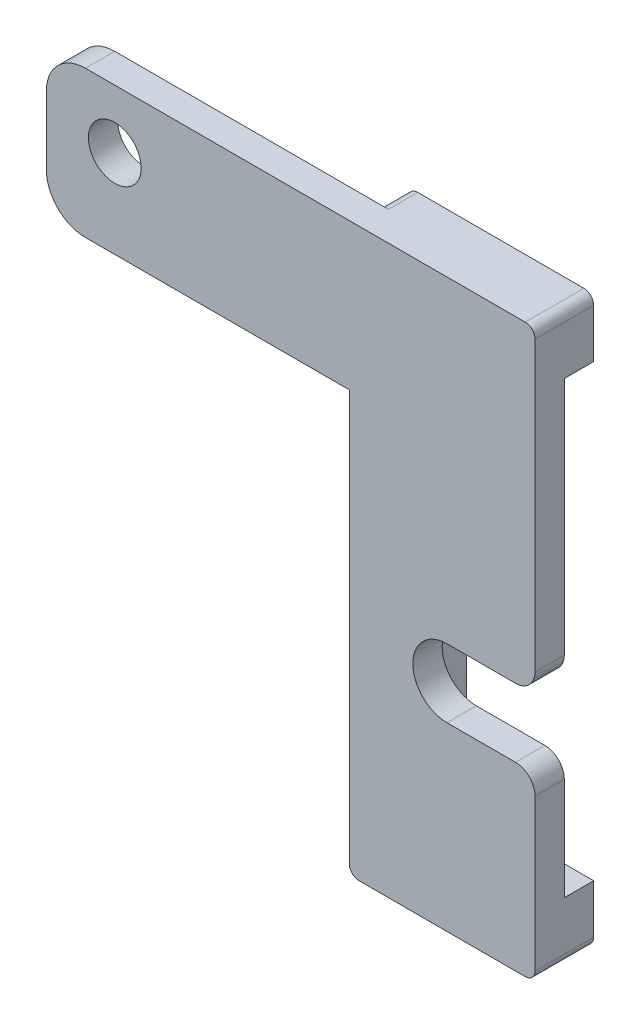
ISO-10303-21;
HEADER;
FILE_DESCRIPTION(('STEP AP214'),'2;1');
FILE_NAME('part.step','',(''),(''),'','','');
FILE_SCHEMA(('AUTOMOTIVE_DESIGN { 1 0 10303 214 1 1 1 1 }'));
ENDSEC;
DATA;
#1=APPLICATION_CONTEXT('core data for automotive mechanical design processes');
#2=APPLICATION_PROTOCOL_DEFINITION('international standard','automotive_design',2000,#1);
#3=PRODUCT_CONTEXT('',#1,'mechanical');
#4=PRODUCT('Part','Part','',(#3));
#5=PRODUCT_RELATED_PRODUCT_CATEGORY('part','',(#4));
#6=PRODUCT_DEFINITION_FORMATION('','',#4);
#7=PRODUCT_DEFINITION_CONTEXT('part definition',#1,'design');
#8=PRODUCT_DEFINITION('design','',#6,#7);
#9=PRODUCT_DEFINITION_SHAPE('','',#8);
#10=(LENGTH_UNIT() NAMED_UNIT(*) SI_UNIT(.MILLI.,.METRE.));
#11=(NAMED_UNIT(*) PLANE_ANGLE_UNIT() SI_UNIT($,.RADIAN.));
#12=(NAMED_UNIT(*) SI_UNIT($,.STERADIAN.) SOLID_ANGLE_UNIT());
#13=UNCERTAINTY_MEASURE_WITH_UNIT(LENGTH_MEASURE(1.E-05),#10,'distance_accuracy_value','');
#14=(GEOMETRIC_REPRESENTATION_CONTEXT(3) GLOBAL_UNCERTAINTY_ASSIGNED_CONTEXT((#13)) GLOBAL_UNIT_ASSIGNED_CONTEXT((#10,
#11,#12)) REPRESENTATION_CONTEXT('',''));
#15=CARTESIAN_POINT('',(0.,0.,0.));
#16=DIRECTION('',(0.,0.,1.));
#17=DIRECTION('',(1.,0.,0.));
#18=AXIS2_PLACEMENT_3D('',#15,#16,#17);
#19=CARTESIAN_POINT('',(50.,15.,-3.));
#20=DIRECTION('',(1.,0.,0.));
#21=DIRECTION('',(0.,1.,0.));
#22=AXIS2_PLACEMENT_3D('',#19,#20,#21);
#23=PLANE('',#22);
#24=DIRECTION('',(0.,-1.,0.));
#25=VECTOR('',#24,1.);
#26=CARTESIAN_POINT('',(50.,15.,-6.));
#27=LINE('',#26,#25);
#28=CARTESIAN_POINT('',(50.,14.,-6.));
#29=VERTEX_POINT('',#28);
#30=CARTESIAN_POINT('',(50.,9.,-6.));
#31=VERTEX_POINT('',#30);
#32=EDGE_CURVE('E237',#29,#31,#27,.T.);
#33=ORIENTED_EDGE('',*,*,#32,.F.);
#34=DIRECTION('',(0.,0.,1.));
#35=VECTOR('',#34,1.);
#36=CARTESIAN_POINT('',(50.,14.,-3.));
#37=LINE('',#36,#35);
#38=CARTESIAN_POINT('',(50.,14.,0.));
#39=VERTEX_POINT('',#38);
#40=EDGE_CURVE('E361',#29,#39,#37,.T.);
#41=ORIENTED_EDGE('',*,*,#40,.T.);
#42=DIRECTION('',(0.,1.,0.));
#43=VECTOR('',#42,1.);
#44=CARTESIAN_POINT('',(50.,15.,0.));
#45=LINE('',#44,#43);
#46=CARTESIAN_POINT('',(50.,-15.5,0.));
#47=VERTEX_POINT('',#46);
#48=EDGE_CURVE('E300',#47,#39,#45,.T.);
#49=ORIENTED_EDGE('',*,*,#48,.F.);
#50=DIRECTION('',(0.,0.,1.));
#51=VECTOR('',#50,1.);
#52=CARTESIAN_POINT('',(50.,-15.5,-3.));
#53=LINE('',#52,#51);
#54=CARTESIAN_POINT('',(50.,-15.5,-3.));
#55=VERTEX_POINT('',#54);
#56=EDGE_CURVE('E341',#47,#55,#53,.F.);
#57=ORIENTED_EDGE('',*,*,#56,.T.);
#58=DIRECTION('',(0.,1.,0.));
#59=VECTOR('',#58,1.);
#60=CARTESIAN_POINT('',(50.,15.,-3.));
#61=LINE('',#60,#59);
#62=CARTESIAN_POINT('',(50.,9.,-3.));
#63=VERTEX_POINT('',#62);
#64=EDGE_CURVE('E284',#55,#63,#61,.T.);
#65=ORIENTED_EDGE('',*,*,#64,.T.);
#66=DIRECTION('',(0.,0.,1.));
#67=VECTOR('',#66,1.);
#68=CARTESIAN_POINT('',(50.,9.,-6.));
#69=LINE('',#68,#67);
#70=EDGE_CURVE('E272',#31,#63,#69,.T.);
#71=ORIENTED_EDGE('',*,*,#70,.F.);
#72=EDGE_LOOP('',(#33,#41,#49,#57,#65,#71));
#73=FACE_BOUND('',#72,.T.);
#74=ADVANCED_FACE('F39',(#73),#23,.T.);
#75=CARTESIAN_POINT('',(0.,0.,-3.));
#76=DIRECTION('',(0.,0.,-1.));
#77=DIRECTION('',(-1.,0.,0.));
#78=AXIS2_PLACEMENT_3D('',#75,#76,#77);
#79=PLANE('',#78);
#80=DIRECTION('',(1.,0.,0.));
#81=VECTOR('',#80,1.);
#82=CARTESIAN_POINT('',(31.,0.,-3.));
#83=LINE('',#82,#81);
#84=CARTESIAN_POINT('',(4.,0.,-3.));
#85=VERTEX_POINT('',#84);
#86=CARTESIAN_POINT('',(31.,0.,-3.));
#87=VERTEX_POINT('',#86);
#88=EDGE_CURVE('E282',#85,#87,#83,.T.);
#89=ORIENTED_EDGE('',*,*,#88,.F.);
#90=CARTESIAN_POINT('',(4.,4.,-3.));
#91=DIRECTION('',(0.,0.,-1.));
#92=DIRECTION('',(-1.,0.,0.));
#93=AXIS2_PLACEMENT_3D('',#90,#91,#92);
#94=CIRCLE('',#93,4.);
#95=CARTESIAN_POINT('',(0.,4.,-3.));
#96=VERTEX_POINT('',#95);
#97=EDGE_CURVE('E321',#85,#96,#94,.T.);
#98=ORIENTED_EDGE('',*,*,#97,.T.);
#99=DIRECTION('',(0.,-1.,0.));
#100=VECTOR('',#99,1.);
#101=CARTESIAN_POINT('',(0.,0.,-3.));
#102=LINE('',#101,#100);
#103=CARTESIAN_POINT('',(0.,11.,-3.));
#104=VERTEX_POINT('',#103);
#105=EDGE_CURVE('E292',#104,#96,#102,.T.);
#106=ORIENTED_EDGE('',*,*,#105,.F.);
#107=CARTESIAN_POINT('',(4.,11.,-3.));
#108=DIRECTION('',(0.,0.,-1.));
#109=DIRECTION('',(-1.,0.,0.));
#110=AXIS2_PLACEMENT_3D('',#107,#108,#109);
#111=CIRCLE('',#110,4.);
#112=CARTESIAN_POINT('',(4.,15.,-3.));
#113=VERTEX_POINT('',#112);
#114=EDGE_CURVE('E319',#104,#113,#111,.T.);
#115=ORIENTED_EDGE('',*,*,#114,.T.);
#116=DIRECTION('',(-1.,0.,0.));
#117=VECTOR('',#116,1.);
#118=CARTESIAN_POINT('',(0.,15.,-3.));
#119=LINE('',#118,#117);
#120=CARTESIAN_POINT('',(32.,15.,-3.));
#121=VERTEX_POINT('',#120);
#122=EDGE_CURVE('E289',#121,#113,#119,.T.);
#123=ORIENTED_EDGE('',*,*,#122,.F.);
#124=CARTESIAN_POINT('',(32.,14.,-3.));
#125=DIRECTION('',(0.,0.,-1.));
#126=DIRECTION('',(-1.,0.,0.));
#127=AXIS2_PLACEMENT_3D('',#124,#125,#126);
#128=CIRCLE('',#127,1.);
#129=CARTESIAN_POINT('',(31.,14.,-3.));
#130=VERTEX_POINT('',#129);
#131=EDGE_CURVE('E11',#121,#130,#128,.F.);
#132=ORIENTED_EDGE('',*,*,#131,.T.);
#133=DIRECTION('',(0.,1.,0.));
#134=VECTOR('',#133,1.);
#135=CARTESIAN_POINT('',(31.,-43.,-3.));
#136=LINE('',#135,#134);
#137=EDGE_CURVE('E252',#87,#130,#136,.T.);
#138=ORIENTED_EDGE('',*,*,#137,.F.);
#139=EDGE_LOOP('',(#89,#98,#106,#115,#123,#132,#138));
#140=FACE_BOUND('',#139,.T.);
#141=CARTESIAN_POINT('',(7.,9.,-3.));
#142=DIRECTION('',(0.,0.,1.));
#143=DIRECTION('',(1.,0.,0.));
#144=AXIS2_PLACEMENT_3D('',#141,#142,#143);
#145=CIRCLE('',#144,2.7);
#146=CARTESIAN_POINT('',(9.7,9.,-3.));
#147=VERTEX_POINT('',#146);
#148=EDGE_CURVE('E276',#147,#147,#145,.T.);
#149=ORIENTED_EDGE('',*,*,#148,.T.);
#150=EDGE_LOOP('',(#149));
#151=FACE_BOUND('',#150,.T.);
#152=ADVANCED_FACE('F459',(#140,#151),#79,.T.);
#153=CARTESIAN_POINT('',(31.,0.,-3.));
#154=DIRECTION('',(0.,-1.,0.));
#155=DIRECTION('',(1.,0.,0.));
#156=AXIS2_PLACEMENT_3D('',#153,#154,#155);
#157=PLANE('',#156);
#158=DIRECTION('',(1.,0.,0.));
#159=VECTOR('',#158,1.);
#160=CARTESIAN_POINT('',(31.,0.,0.));
#161=LINE('',#160,#159);
#162=CARTESIAN_POINT('',(4.,0.,0.));
#163=VERTEX_POINT('',#162);
#164=CARTESIAN_POINT('',(31.,0.,0.));
#165=VERTEX_POINT('',#164);
#166=EDGE_CURVE('E279',#163,#165,#161,.T.);
#167=ORIENTED_EDGE('',*,*,#166,.F.);
#168=DIRECTION('',(0.,0.,1.));
#169=VECTOR('',#168,1.);
#170=CARTESIAN_POINT('',(4.,0.,-3.));
#171=LINE('',#170,#169);
#172=EDGE_CURVE('E317',#163,#85,#171,.F.);
#173=ORIENTED_EDGE('',*,*,#172,.T.);
#174=ORIENTED_EDGE('',*,*,#88,.T.);
#175=DIRECTION('',(0.,0.,1.));
#176=VECTOR('',#175,1.);
#177=CARTESIAN_POINT('',(31.,0.,-3.));
#178=LINE('',#177,#176);
#179=EDGE_CURVE('E256',#87,#165,#178,.T.);
#180=ORIENTED_EDGE('',*,*,#179,.T.);
#181=EDGE_LOOP('',(#167,#173,#174,#180));
#182=FACE_BOUND('',#181,.T.);
#183=ADVANCED_FACE('F440',(#182),#157,.T.);
#184=CARTESIAN_POINT('',(0.,0.,-3.));
#185=DIRECTION('',(-1.,0.,0.));
#186=DIRECTION('',(0.,0.,1.));
#187=AXIS2_PLACEMENT_3D('',#184,#185,#186);
#188=PLANE('',#187);
#189=ORIENTED_EDGE('',*,*,#105,.T.);
#190=DIRECTION('',(0.,0.,1.));
#191=VECTOR('',#190,1.);
#192=CARTESIAN_POINT('',(0.,4.,-3.));
#193=LINE('',#192,#191);
#194=CARTESIAN_POINT('',(0.,4.,0.));
#195=VERTEX_POINT('',#194);
#196=EDGE_CURVE('E310',#96,#195,#193,.T.);
#197=ORIENTED_EDGE('',*,*,#196,.T.);
#198=DIRECTION('',(0.,-1.,0.));
#199=VECTOR('',#198,1.);
#200=CARTESIAN_POINT('',(0.,0.,0.));
#201=LINE('',#200,#199);
#202=CARTESIAN_POINT('',(0.,11.,0.));
#203=VERTEX_POINT('',#202);
#204=EDGE_CURVE('E285',#203,#195,#201,.T.);
#205=ORIENTED_EDGE('',*,*,#204,.F.);
#206=DIRECTION('',(0.,0.,1.));
#207=VECTOR('',#206,1.);
#208=CARTESIAN_POINT('',(0.,11.,-3.));
#209=LINE('',#208,#207);
#210=EDGE_CURVE('E255',#203,#104,#209,.F.);
#211=ORIENTED_EDGE('',*,*,#210,.T.);
#212=EDGE_LOOP('',(#189,#197,#205,#211));
#213=FACE_BOUND('',#212,.T.);
#214=ADVANCED_FACE('F431',(#213),#188,.T.);
#215=CARTESIAN_POINT('',(0.,15.,-3.));
#216=DIRECTION('',(0.,1.,0.));
#217=DIRECTION('',(0.,0.,1.));
#218=AXIS2_PLACEMENT_3D('',#215,#216,#217);
#219=PLANE('',#218);
#220=DIRECTION('',(1.,0.,0.));
#221=VECTOR('',#220,1.);
#222=CARTESIAN_POINT('',(31.,15.,-6.));
#223=LINE('',#222,#221);
#224=CARTESIAN_POINT('',(32.,15.,-6.));
#225=VERTEX_POINT('',#224);
#226=CARTESIAN_POINT('',(49.,15.,-6.));
#227=VERTEX_POINT('',#226);
#228=EDGE_CURVE('E233',#225,#227,#223,.T.);
#229=ORIENTED_EDGE('',*,*,#228,.F.);
#230=DIRECTION('',(0.,0.,1.));
#231=VECTOR('',#230,1.);
#232=CARTESIAN_POINT('',(32.,15.,-3.));
#233=LINE('',#232,#231);
#234=EDGE_CURVE('E345',#225,#121,#233,.T.);
#235=ORIENTED_EDGE('',*,*,#234,.T.);
#236=ORIENTED_EDGE('',*,*,#122,.T.);
#237=DIRECTION('',(0.,0.,1.));
#238=VECTOR('',#237,1.);
#239=CARTESIAN_POINT('',(4.,15.,-3.));
#240=LINE('',#239,#238);
#241=CARTESIAN_POINT('',(4.,15.,0.));
#242=VERTEX_POINT('',#241);
#243=EDGE_CURVE('E323',#113,#242,#240,.T.);
#244=ORIENTED_EDGE('',*,*,#243,.T.);
#245=DIRECTION('',(-1.,0.,0.));
#246=VECTOR('',#245,1.);
#247=CARTESIAN_POINT('',(0.,15.,0.));
#248=LINE('',#247,#246);
#249=CARTESIAN_POINT('',(49.,15.,0.));
#250=VERTEX_POINT('',#249);
#251=EDGE_CURVE('E303',#250,#242,#248,.T.);
#252=ORIENTED_EDGE('',*,*,#251,.F.);
#253=DIRECTION('',(0.,0.,1.));
#254=VECTOR('',#253,1.);
#255=CARTESIAN_POINT('',(49.,15.,-3.));
#256=LINE('',#255,#254);
#257=EDGE_CURVE('E343',#250,#227,#256,.F.);
#258=ORIENTED_EDGE('',*,*,#257,.T.);
#259=EDGE_LOOP('',(#229,#235,#236,#244,#252,#258));
#260=FACE_BOUND('',#259,.T.);
#261=ADVANCED_FACE('F423',(#260),#219,.T.);
#262=CARTESIAN_POINT('',(50.,-42.,0.));
#263=VERTEX_POINT('',#262);
#264=CARTESIAN_POINT('',(50.,-26.5,0.));
#265=VERTEX_POINT('',#264);
#266=EDGE_CURVE('E301',#263,#265,#45,.T.);
#267=ORIENTED_EDGE('',*,*,#266,.F.);
#268=DIRECTION('',(0.,0.,1.));
#269=VECTOR('',#268,1.);
#270=CARTESIAN_POINT('',(50.,-42.,-3.));
#271=LINE('',#270,#269);
#272=CARTESIAN_POINT('',(50.,-42.,-6.));
#273=VERTEX_POINT('',#272);
#274=EDGE_CURVE('E47',#263,#273,#271,.F.);
#275=ORIENTED_EDGE('',*,*,#274,.T.);
#276=DIRECTION('',(0.,-1.,0.));
#277=VECTOR('',#276,1.);
#278=CARTESIAN_POINT('',(50.,-37.,-6.));
#279=LINE('',#278,#277);
#280=CARTESIAN_POINT('',(50.,-37.,-6.));
#281=VERTEX_POINT('',#280);
#282=EDGE_CURVE('E245',#281,#273,#279,.T.);
#283=ORIENTED_EDGE('',*,*,#282,.F.);
#284=DIRECTION('',(0.,0.,1.));
#285=VECTOR('',#284,1.);
#286=CARTESIAN_POINT('',(50.,-37.,-6.));
#287=LINE('',#286,#285);
#288=CARTESIAN_POINT('',(50.,-37.,-3.));
#289=VERTEX_POINT('',#288);
#290=EDGE_CURVE('E251',#281,#289,#287,.T.);
#291=ORIENTED_EDGE('',*,*,#290,.T.);
#292=CARTESIAN_POINT('',(50.,-26.5,-3.));
#293=VERTEX_POINT('',#292);
#294=EDGE_CURVE('E286',#289,#293,#61,.T.);
#295=ORIENTED_EDGE('',*,*,#294,.T.);
#296=DIRECTION('',(0.,0.,1.));
#297=VECTOR('',#296,1.);
#298=CARTESIAN_POINT('',(50.,-26.5,0.));
#299=LINE('',#298,#297);
#300=EDGE_CURVE('E326',#293,#265,#299,.T.);
#301=ORIENTED_EDGE('',*,*,#300,.T.);
#302=EDGE_LOOP('',(#267,#275,#283,#291,#295,#301));
#303=FACE_BOUND('',#302,.T.);
#304=ADVANCED_FACE('F374',(#303),#23,.T.);
#305=CARTESIAN_POINT('',(50.,-43.,-3.));
#306=DIRECTION('',(0.,-1.,0.));
#307=DIRECTION('',(0.,0.,-1.));
#308=AXIS2_PLACEMENT_3D('',#305,#306,#307);
#309=PLANE('',#308);
#310=DIRECTION('',(1.,0.,0.));
#311=VECTOR('',#310,1.);
#312=CARTESIAN_POINT('',(50.,-43.,0.));
#313=LINE('',#312,#311);
#314=CARTESIAN_POINT('',(32.,-43.,0.));
#315=VERTEX_POINT('',#314);
#316=CARTESIAN_POINT('',(49.,-43.,0.));
#317=VERTEX_POINT('',#316);
#318=EDGE_CURVE('E298',#315,#317,#313,.T.);
#319=ORIENTED_EDGE('',*,*,#318,.F.);
#320=DIRECTION('',(0.,0.,1.));
#321=VECTOR('',#320,1.);
#322=CARTESIAN_POINT('',(32.,-43.,-3.));
#323=LINE('',#322,#321);
#324=CARTESIAN_POINT('',(32.,-43.,-6.));
#325=VERTEX_POINT('',#324);
#326=EDGE_CURVE('E370',#315,#325,#323,.F.);
#327=ORIENTED_EDGE('',*,*,#326,.T.);
#328=DIRECTION('',(-1.,0.,0.));
#329=VECTOR('',#328,1.);
#330=CARTESIAN_POINT('',(31.,-43.,-6.));
#331=LINE('',#330,#329);
#332=CARTESIAN_POINT('',(49.,-43.,-6.));
#333=VERTEX_POINT('',#332);
#334=EDGE_CURVE('E248',#333,#325,#331,.T.);
#335=ORIENTED_EDGE('',*,*,#334,.F.);
#336=DIRECTION('',(0.,0.,1.));
#337=VECTOR('',#336,1.);
#338=CARTESIAN_POINT('',(49.,-43.,-3.));
#339=LINE('',#338,#337);
#340=EDGE_CURVE('E368',#333,#317,#339,.T.);
#341=ORIENTED_EDGE('',*,*,#340,.T.);
#342=EDGE_LOOP('',(#319,#327,#335,#341));
#343=FACE_BOUND('',#342,.T.);
#344=ADVANCED_FACE('F382',(#343),#309,.T.);
#345=CARTESIAN_POINT('',(31.,-43.,-3.));
#346=DIRECTION('',(-1.,0.,0.));
#347=DIRECTION('',(0.,0.,1.));
#348=AXIS2_PLACEMENT_3D('',#345,#346,#347);
#349=PLANE('',#348);
#350=ORIENTED_EDGE('',*,*,#137,.T.);
#351=DIRECTION('',(0.,0.,1.));
#352=VECTOR('',#351,1.);
#353=CARTESIAN_POINT('',(31.,14.,-3.));
#354=LINE('',#353,#352);
#355=CARTESIAN_POINT('',(31.,14.,-6.));
#356=VERTEX_POINT('',#355);
#357=EDGE_CURVE('E351',#130,#356,#354,.F.);
#358=ORIENTED_EDGE('',*,*,#357,.T.);
#359=DIRECTION('',(0.,1.,0.));
#360=VECTOR('',#359,1.);
#361=CARTESIAN_POINT('',(31.,-43.,-6.));
#362=LINE('',#361,#360);
#363=CARTESIAN_POINT('',(31.,-42.,-6.));
#364=VERTEX_POINT('',#363);
#365=EDGE_CURVE('E230',#364,#356,#362,.T.);
#366=ORIENTED_EDGE('',*,*,#365,.F.);
#367=DIRECTION('',(0.,0.,1.));
#368=VECTOR('',#367,1.);
#369=CARTESIAN_POINT('',(31.,-42.,-3.));
#370=LINE('',#369,#368);
#371=CARTESIAN_POINT('',(31.,-42.,0.));
#372=VERTEX_POINT('',#371);
#373=EDGE_CURVE('E348',#364,#372,#370,.T.);
#374=ORIENTED_EDGE('',*,*,#373,.T.);
#375=DIRECTION('',(0.,-1.,0.));
#376=VECTOR('',#375,1.);
#377=CARTESIAN_POINT('',(31.,-43.,0.));
#378=LINE('',#377,#376);
#379=EDGE_CURVE('E296',#165,#372,#378,.T.);
#380=ORIENTED_EDGE('',*,*,#379,.F.);
#381=ORIENTED_EDGE('',*,*,#179,.F.);
#382=EDGE_LOOP('',(#350,#358,#366,#374,#380,#381));
#383=FACE_BOUND('',#382,.T.);
#384=ADVANCED_FACE('F446',(#383),#349,.T.);
#385=DIRECTION('',(1.,0.,0.));
#386=VECTOR('',#385,1.);
#387=CARTESIAN_POINT('',(50.,-24.5,-3.));
#388=LINE('',#387,#386);
#389=CARTESIAN_POINT('',(41.,-24.5,-3.));
#390=VERTEX_POINT('',#389);
#391=CARTESIAN_POINT('',(48.,-24.5,-3.));
#392=VERTEX_POINT('',#391);
#393=EDGE_CURVE('E210',#390,#392,#388,.T.);
#394=ORIENTED_EDGE('',*,*,#393,.T.);
#395=CARTESIAN_POINT('',(48.,-26.5,-3.));
#396=DIRECTION('',(0.,0.,-1.));
#397=DIRECTION('',(-1.,0.,0.));
#398=AXIS2_PLACEMENT_3D('',#395,#396,#397);
#399=CIRCLE('',#398,2.);
#400=EDGE_CURVE('E336',#392,#293,#399,.T.);
#401=ORIENTED_EDGE('',*,*,#400,.T.);
#402=ORIENTED_EDGE('',*,*,#294,.F.);
#403=DIRECTION('',(1.,0.,0.));
#404=VECTOR('',#403,1.);
#405=CARTESIAN_POINT('',(37.,-37.,-3.));
#406=LINE('',#405,#404);
#407=CARTESIAN_POINT('',(37.,-37.,-3.));
#408=VERTEX_POINT('',#407);
#409=EDGE_CURVE('E234',#408,#289,#406,.T.);
#410=ORIENTED_EDGE('',*,*,#409,.F.);
#411=DIRECTION('',(0.,-1.,0.));
#412=VECTOR('',#411,1.);
#413=CARTESIAN_POINT('',(37.,9.,-3.));
#414=LINE('',#413,#412);
#415=CARTESIAN_POINT('',(37.,9.,-3.));
#416=VERTEX_POINT('',#415);
#417=EDGE_CURVE('E259',#416,#408,#414,.T.);
#418=ORIENTED_EDGE('',*,*,#417,.F.);
#419=DIRECTION('',(-1.,0.,0.));
#420=VECTOR('',#419,1.);
#421=CARTESIAN_POINT('',(50.,9.,-3.));
#422=LINE('',#421,#420);
#423=EDGE_CURVE('E228',#63,#416,#422,.T.);
#424=ORIENTED_EDGE('',*,*,#423,.F.);
#425=ORIENTED_EDGE('',*,*,#64,.F.);
#426=CARTESIAN_POINT('',(48.,-15.5,-3.));
#427=DIRECTION('',(0.,0.,-1.));
#428=DIRECTION('',(-1.,0.,0.));
#429=AXIS2_PLACEMENT_3D('',#426,#427,#428);
#430=CIRCLE('',#429,2.);
#431=CARTESIAN_POINT('',(48.,-17.5,-3.));
#432=VERTEX_POINT('',#431);
#433=EDGE_CURVE('E334',#55,#432,#430,.T.);
#434=ORIENTED_EDGE('',*,*,#433,.T.);
#435=DIRECTION('',(-1.,0.,0.));
#436=VECTOR('',#435,1.);
#437=CARTESIAN_POINT('',(41.,-17.5,-3.));
#438=LINE('',#437,#436);
#439=CARTESIAN_POINT('',(41.,-17.5,-3.));
#440=VERTEX_POINT('',#439);
#441=EDGE_CURVE('E207',#432,#440,#438,.T.);
#442=ORIENTED_EDGE('',*,*,#441,.T.);
#443=CARTESIAN_POINT('',(41.,-21.,-3.));
#444=DIRECTION('',(0.,0.,1.));
#445=DIRECTION('',(1.,0.,0.));
#446=AXIS2_PLACEMENT_3D('',#443,#444,#445);
#447=CIRCLE('',#446,3.5);
#448=EDGE_CURVE('E200',#440,#390,#447,.T.);
#449=ORIENTED_EDGE('',*,*,#448,.T.);
#450=EDGE_LOOP('',(#394,#401,#402,#410,#418,#424,#425,#434,#442,#449));
#451=FACE_BOUND('',#450,.T.);
#452=ADVANCED_FACE('F217',(#451),#79,.T.);
#453=CARTESIAN_POINT('',(0.,0.,0.));
#454=DIRECTION('',(0.,0.,-1.));
#455=DIRECTION('',(-1.,0.,0.));
#456=AXIS2_PLACEMENT_3D('',#453,#454,#455);
#457=PLANE('',#456);
#458=CARTESIAN_POINT('',(7.,9.,0.));
#459=DIRECTION('',(0.,0.,1.));
#460=DIRECTION('',(1.,0.,0.));
#461=AXIS2_PLACEMENT_3D('',#458,#459,#460);
#462=CIRCLE('',#461,2.7);
#463=CARTESIAN_POINT('',(9.7,9.,0.));
#464=VERTEX_POINT('',#463);
#465=EDGE_CURVE('E275',#464,#464,#462,.T.);
#466=ORIENTED_EDGE('',*,*,#465,.F.);
#467=EDGE_LOOP('',(#466));
#468=FACE_BOUND('',#467,.T.);
#469=ORIENTED_EDGE('',*,*,#48,.T.);
#470=CARTESIAN_POINT('',(49.,14.,0.));
#471=DIRECTION('',(0.,0.,-1.));
#472=DIRECTION('',(-1.,0.,0.));
#473=AXIS2_PLACEMENT_3D('',#470,#471,#472);
#474=CIRCLE('',#473,1.);
#475=EDGE_CURVE('E366',#39,#250,#474,.F.);
#476=ORIENTED_EDGE('',*,*,#475,.T.);
#477=ORIENTED_EDGE('',*,*,#251,.T.);
#478=CARTESIAN_POINT('',(4.,11.,0.));
#479=DIRECTION('',(0.,0.,-1.));
#480=DIRECTION('',(-1.,0.,0.));
#481=AXIS2_PLACEMENT_3D('',#478,#479,#480);
#482=CIRCLE('',#481,4.);
#483=EDGE_CURVE('E313',#242,#203,#482,.F.);
#484=ORIENTED_EDGE('',*,*,#483,.T.);
#485=ORIENTED_EDGE('',*,*,#204,.T.);
#486=CARTESIAN_POINT('',(4.,4.,0.));
#487=DIRECTION('',(0.,0.,-1.));
#488=DIRECTION('',(-1.,0.,0.));
#489=AXIS2_PLACEMENT_3D('',#486,#487,#488);
#490=CIRCLE('',#489,4.);
#491=EDGE_CURVE('E315',#195,#163,#490,.F.);
#492=ORIENTED_EDGE('',*,*,#491,.T.);
#493=ORIENTED_EDGE('',*,*,#166,.T.);
#494=ORIENTED_EDGE('',*,*,#379,.T.);
#495=CARTESIAN_POINT('',(32.,-42.,0.));
#496=DIRECTION('',(0.,0.,-1.));
#497=DIRECTION('',(-1.,0.,0.));
#498=AXIS2_PLACEMENT_3D('',#495,#496,#497);
#499=CIRCLE('',#498,1.);
#500=EDGE_CURVE('E62',#372,#315,#499,.F.);
#501=ORIENTED_EDGE('',*,*,#500,.T.);
#502=ORIENTED_EDGE('',*,*,#318,.T.);
#503=CARTESIAN_POINT('',(49.,-42.,0.));
#504=DIRECTION('',(0.,0.,-1.));
#505=DIRECTION('',(-1.,0.,0.));
#506=AXIS2_PLACEMENT_3D('',#503,#504,#505);
#507=CIRCLE('',#506,1.);
#508=EDGE_CURVE('E54',#317,#263,#507,.F.);
#509=ORIENTED_EDGE('',*,*,#508,.T.);
#510=ORIENTED_EDGE('',*,*,#266,.T.);
#511=CARTESIAN_POINT('',(48.,-26.5,0.));
#512=DIRECTION('',(0.,0.,-1.));
#513=DIRECTION('',(-1.,0.,0.));
#514=AXIS2_PLACEMENT_3D('',#511,#512,#513);
#515=CIRCLE('',#514,2.);
#516=CARTESIAN_POINT('',(48.,-24.5,0.));
#517=VERTEX_POINT('',#516);
#518=EDGE_CURVE('E331',#265,#517,#515,.F.);
#519=ORIENTED_EDGE('',*,*,#518,.T.);
#520=DIRECTION('',(1.,0.,0.));
#521=VECTOR('',#520,1.);
#522=CARTESIAN_POINT('',(50.,-24.5,0.));
#523=LINE('',#522,#521);
#524=CARTESIAN_POINT('',(41.,-24.5,0.));
#525=VERTEX_POINT('',#524);
#526=EDGE_CURVE('E222',#525,#517,#523,.T.);
#527=ORIENTED_EDGE('',*,*,#526,.F.);
#528=CARTESIAN_POINT('',(41.,-21.,0.));
#529=DIRECTION('',(0.,0.,1.));
#530=DIRECTION('',(1.,0.,0.));
#531=AXIS2_PLACEMENT_3D('',#528,#529,#530);
#532=CIRCLE('',#531,3.5);
#533=CARTESIAN_POINT('',(41.,-17.5,0.));
#534=VERTEX_POINT('',#533);
#535=EDGE_CURVE('E202',#534,#525,#532,.T.);
#536=ORIENTED_EDGE('',*,*,#535,.F.);
#537=DIRECTION('',(-1.,0.,0.));
#538=VECTOR('',#537,1.);
#539=CARTESIAN_POINT('',(41.,-17.5,0.));
#540=LINE('',#539,#538);
#541=CARTESIAN_POINT('',(48.,-17.5,0.));
#542=VERTEX_POINT('',#541);
#543=EDGE_CURVE('E220',#542,#534,#540,.T.);
#544=ORIENTED_EDGE('',*,*,#543,.F.);
#545=CARTESIAN_POINT('',(48.,-15.5,0.));
#546=DIRECTION('',(0.,0.,-1.));
#547=DIRECTION('',(-1.,0.,0.));
#548=AXIS2_PLACEMENT_3D('',#545,#546,#547);
#549=CIRCLE('',#548,2.);
#550=EDGE_CURVE('E329',#542,#47,#549,.F.);
#551=ORIENTED_EDGE('',*,*,#550,.T.);
#552=EDGE_LOOP('',(#469,#476,#477,#484,#485,#492,#493,#494,#501,#502,#509,#510,#519,#527,#536,
#544,#551));
#553=FACE_BOUND('',#552,.T.);
#554=ADVANCED_FACE('F385',(#468,#553),#457,.F.);
#555=CARTESIAN_POINT('',(7.,9.,-3.));
#556=DIRECTION('',(0.,0.,1.));
#557=DIRECTION('',(1.,0.,0.));
#558=AXIS2_PLACEMENT_3D('',#555,#556,#557);
#559=CYLINDRICAL_SURFACE('',#558,2.7);
#560=ORIENTED_EDGE('',*,*,#148,.F.);
#561=EDGE_LOOP('',(#560));
#562=FACE_BOUND('',#561,.T.);
#563=ORIENTED_EDGE('',*,*,#465,.T.);
#564=EDGE_LOOP('',(#563));
#565=FACE_BOUND('',#564,.T.);
#566=ADVANCED_FACE('F465',(#562,#565),#559,.F.);
#567=CARTESIAN_POINT('',(50.,9.,-6.));
#568=DIRECTION('',(0.,1.,0.));
#569=DIRECTION('',(-1.,0.,0.));
#570=AXIS2_PLACEMENT_3D('',#567,#568,#569);
#571=PLANE('',#570);
#572=ORIENTED_EDGE('',*,*,#423,.T.);
#573=DIRECTION('',(0.,0.,1.));
#574=VECTOR('',#573,1.);
#575=CARTESIAN_POINT('',(37.,9.,-6.));
#576=LINE('',#575,#574);
#577=CARTESIAN_POINT('',(37.,9.,-6.));
#578=VERTEX_POINT('',#577);
#579=EDGE_CURVE('E269',#578,#416,#576,.T.);
#580=ORIENTED_EDGE('',*,*,#579,.F.);
#581=DIRECTION('',(-1.,0.,0.));
#582=VECTOR('',#581,1.);
#583=CARTESIAN_POINT('',(50.,9.,-6.));
#584=LINE('',#583,#582);
#585=EDGE_CURVE('E239',#31,#578,#584,.T.);
#586=ORIENTED_EDGE('',*,*,#585,.F.);
#587=ORIENTED_EDGE('',*,*,#70,.T.);
#588=EDGE_LOOP('',(#572,#580,#586,#587));
#589=FACE_BOUND('',#588,.T.);
#590=ADVANCED_FACE('F400',(#589),#571,.F.);
#591=CARTESIAN_POINT('',(37.,9.,-6.));
#592=DIRECTION('',(-1.,0.,0.));
#593=DIRECTION('',(0.,-1.,0.));
#594=AXIS2_PLACEMENT_3D('',#591,#592,#593);
#595=PLANE('',#594);
#596=ORIENTED_EDGE('',*,*,#417,.T.);
#597=DIRECTION('',(0.,0.,1.));
#598=VECTOR('',#597,1.);
#599=CARTESIAN_POINT('',(37.,-37.,-6.));
#600=LINE('',#599,#598);
#601=CARTESIAN_POINT('',(37.,-37.,-6.));
#602=VERTEX_POINT('',#601);
#603=EDGE_CURVE('E266',#602,#408,#600,.T.);
#604=ORIENTED_EDGE('',*,*,#603,.F.);
#605=DIRECTION('',(0.,-1.,0.));
#606=VECTOR('',#605,1.);
#607=CARTESIAN_POINT('',(37.,9.,-6.));
#608=LINE('',#607,#606);
#609=EDGE_CURVE('E241',#578,#602,#608,.T.);
#610=ORIENTED_EDGE('',*,*,#609,.F.);
#611=ORIENTED_EDGE('',*,*,#579,.T.);
#612=EDGE_LOOP('',(#596,#604,#610,#611));
#613=FACE_BOUND('',#612,.T.);
#614=ADVANCED_FACE('F395',(#613),#595,.F.);
#615=CARTESIAN_POINT('',(37.,-37.,-6.));
#616=DIRECTION('',(0.,-1.,0.));
#617=DIRECTION('',(0.,0.,-1.));
#618=AXIS2_PLACEMENT_3D('',#615,#616,#617);
#619=PLANE('',#618);
#620=ORIENTED_EDGE('',*,*,#409,.T.);
#621=ORIENTED_EDGE('',*,*,#290,.F.);
#622=DIRECTION('',(1.,0.,0.));
#623=VECTOR('',#622,1.);
#624=CARTESIAN_POINT('',(37.,-37.,-6.));
#625=LINE('',#624,#623);
#626=EDGE_CURVE('E243',#602,#281,#625,.T.);
#627=ORIENTED_EDGE('',*,*,#626,.F.);
#628=ORIENTED_EDGE('',*,*,#603,.T.);
#629=EDGE_LOOP('',(#620,#621,#627,#628));
#630=FACE_BOUND('',#629,.T.);
#631=ADVANCED_FACE('F391',(#630),#619,.F.);
#632=CARTESIAN_POINT('',(0.,0.,-6.));
#633=DIRECTION('',(0.,0.,-1.));
#634=DIRECTION('',(-1.,0.,0.));
#635=AXIS2_PLACEMENT_3D('',#632,#633,#634);
#636=PLANE('',#635);
#637=ORIENTED_EDGE('',*,*,#365,.T.);
#638=CARTESIAN_POINT('',(32.,14.,-6.));
#639=DIRECTION('',(0.,0.,-1.));
#640=DIRECTION('',(-1.,0.,0.));
#641=AXIS2_PLACEMENT_3D('',#638,#639,#640);
#642=CIRCLE('',#641,1.);
#643=EDGE_CURVE('E359',#356,#225,#642,.T.);
#644=ORIENTED_EDGE('',*,*,#643,.T.);
#645=ORIENTED_EDGE('',*,*,#228,.T.);
#646=CARTESIAN_POINT('',(49.,14.,-6.));
#647=DIRECTION('',(0.,0.,-1.));
#648=DIRECTION('',(-1.,0.,0.));
#649=AXIS2_PLACEMENT_3D('',#646,#647,#648);
#650=CIRCLE('',#649,1.);
#651=EDGE_CURVE('E357',#227,#29,#650,.T.);
#652=ORIENTED_EDGE('',*,*,#651,.T.);
#653=ORIENTED_EDGE('',*,*,#32,.T.);
#654=ORIENTED_EDGE('',*,*,#585,.T.);
#655=ORIENTED_EDGE('',*,*,#609,.T.);
#656=ORIENTED_EDGE('',*,*,#626,.T.);
#657=ORIENTED_EDGE('',*,*,#282,.T.);
#658=CARTESIAN_POINT('',(49.,-42.,-6.));
#659=DIRECTION('',(0.,0.,-1.));
#660=DIRECTION('',(-1.,0.,0.));
#661=AXIS2_PLACEMENT_3D('',#658,#659,#660);
#662=CIRCLE('',#661,1.);
#663=EDGE_CURVE('E353',#273,#333,#662,.T.);
#664=ORIENTED_EDGE('',*,*,#663,.T.);
#665=ORIENTED_EDGE('',*,*,#334,.T.);
#666=CARTESIAN_POINT('',(32.,-42.,-6.));
#667=DIRECTION('',(0.,0.,-1.));
#668=DIRECTION('',(-1.,0.,0.));
#669=AXIS2_PLACEMENT_3D('',#666,#667,#668);
#670=CIRCLE('',#669,1.);
#671=EDGE_CURVE('E355',#325,#364,#670,.T.);
#672=ORIENTED_EDGE('',*,*,#671,.T.);
#673=EDGE_LOOP('',(#637,#644,#645,#652,#653,#654,#655,#656,#657,#664,#665,#672));
#674=FACE_BOUND('',#673,.T.);
#675=ADVANCED_FACE('F377',(#674),#636,.T.);
#676=CARTESIAN_POINT('',(41.,-21.,-3.));
#677=DIRECTION('',(0.,0.,1.));
#678=DIRECTION('',(1.,0.,0.));
#679=AXIS2_PLACEMENT_3D('',#676,#677,#678);
#680=CYLINDRICAL_SURFACE('',#679,3.5);
#681=ORIENTED_EDGE('',*,*,#535,.T.);
#682=DIRECTION('',(0.,0.,1.));
#683=VECTOR('',#682,1.);
#684=CARTESIAN_POINT('',(41.,-24.5,-3.));
#685=LINE('',#684,#683);
#686=EDGE_CURVE('E195',#390,#525,#685,.T.);
#687=ORIENTED_EDGE('',*,*,#686,.F.);
#688=ORIENTED_EDGE('',*,*,#448,.F.);
#689=DIRECTION('',(0.,0.,1.));
#690=VECTOR('',#689,1.);
#691=CARTESIAN_POINT('',(41.,-17.5,-3.));
#692=LINE('',#691,#690);
#693=EDGE_CURVE('E206',#440,#534,#692,.T.);
#694=ORIENTED_EDGE('',*,*,#693,.T.);
#695=EDGE_LOOP('',(#681,#687,#688,#694));
#696=FACE_BOUND('',#695,.T.);
#697=ADVANCED_FACE('F197',(#696),#680,.F.);
#698=CARTESIAN_POINT('',(41.,-17.5,-3.));
#699=DIRECTION('',(0.,1.,0.));
#700=DIRECTION('',(-1.,0.,0.));
#701=AXIS2_PLACEMENT_3D('',#698,#699,#700);
#702=PLANE('',#701);
#703=ORIENTED_EDGE('',*,*,#441,.F.);
#704=DIRECTION('',(0.,0.,1.));
#705=VECTOR('',#704,1.);
#706=CARTESIAN_POINT('',(48.,-17.5,0.));
#707=LINE('',#706,#705);
#708=EDGE_CURVE('E338',#432,#542,#707,.T.);
#709=ORIENTED_EDGE('',*,*,#708,.T.);
#710=ORIENTED_EDGE('',*,*,#543,.T.);
#711=ORIENTED_EDGE('',*,*,#693,.F.);
#712=EDGE_LOOP('',(#703,#709,#710,#711));
#713=FACE_BOUND('',#712,.T.);
#714=ADVANCED_FACE('F414',(#713),#702,.F.);
#715=CARTESIAN_POINT('',(50.,-24.5,-3.));
#716=DIRECTION('',(0.,-1.,0.));
#717=DIRECTION('',(1.,0.,0.));
#718=AXIS2_PLACEMENT_3D('',#715,#716,#717);
#719=PLANE('',#718);
#720=ORIENTED_EDGE('',*,*,#526,.T.);
#721=DIRECTION('',(0.,0.,1.));
#722=VECTOR('',#721,1.);
#723=CARTESIAN_POINT('',(48.,-24.5,-3.));
#724=LINE('',#723,#722);
#725=EDGE_CURVE('E213',#517,#392,#724,.F.);
#726=ORIENTED_EDGE('',*,*,#725,.T.);
#727=ORIENTED_EDGE('',*,*,#393,.F.);
#728=ORIENTED_EDGE('',*,*,#686,.T.);
#729=EDGE_LOOP('',(#720,#726,#727,#728));
#730=FACE_BOUND('',#729,.T.);
#731=ADVANCED_FACE('F211',(#730),#719,.F.);
#732=CARTESIAN_POINT('',(4.,4.,-3.));
#733=DIRECTION('',(0.,0.,1.));
#734=DIRECTION('',(1.,0.,0.));
#735=AXIS2_PLACEMENT_3D('',#732,#733,#734);
#736=CYLINDRICAL_SURFACE('',#735,4.);
#737=ORIENTED_EDGE('',*,*,#97,.F.);
#738=ORIENTED_EDGE('',*,*,#172,.F.);
#739=ORIENTED_EDGE('',*,*,#491,.F.);
#740=ORIENTED_EDGE('',*,*,#196,.F.);
#741=EDGE_LOOP('',(#737,#738,#739,#740));
#742=FACE_BOUND('',#741,.T.);
#743=ADVANCED_FACE('F436',(#742),#736,.T.);
#744=CARTESIAN_POINT('',(4.,11.,-3.));
#745=DIRECTION('',(0.,0.,1.));
#746=DIRECTION('',(1.,0.,0.));
#747=AXIS2_PLACEMENT_3D('',#744,#745,#746);
#748=CYLINDRICAL_SURFACE('',#747,4.);
#749=ORIENTED_EDGE('',*,*,#114,.F.);
#750=ORIENTED_EDGE('',*,*,#210,.F.);
#751=ORIENTED_EDGE('',*,*,#483,.F.);
#752=ORIENTED_EDGE('',*,*,#243,.F.);
#753=EDGE_LOOP('',(#749,#750,#751,#752));
#754=FACE_BOUND('',#753,.T.);
#755=ADVANCED_FACE('F427',(#754),#748,.T.);
#756=CARTESIAN_POINT('',(48.,-26.5,-3.));
#757=DIRECTION('',(0.,0.,-1.));
#758=DIRECTION('',(-1.,0.,0.));
#759=AXIS2_PLACEMENT_3D('',#756,#757,#758);
#760=CYLINDRICAL_SURFACE('',#759,2.);
#761=ORIENTED_EDGE('',*,*,#400,.F.);
#762=ORIENTED_EDGE('',*,*,#725,.F.);
#763=ORIENTED_EDGE('',*,*,#518,.F.);
#764=ORIENTED_EDGE('',*,*,#300,.F.);
#765=EDGE_LOOP('',(#761,#762,#763,#764));
#766=FACE_BOUND('',#765,.T.);
#767=ADVANCED_FACE('F389',(#766),#760,.T.);
#768=CARTESIAN_POINT('',(48.,-15.5,-3.));
#769=DIRECTION('',(0.,0.,-1.));
#770=DIRECTION('',(-1.,0.,0.));
#771=AXIS2_PLACEMENT_3D('',#768,#769,#770);
#772=CYLINDRICAL_SURFACE('',#771,2.);
#773=ORIENTED_EDGE('',*,*,#433,.F.);
#774=ORIENTED_EDGE('',*,*,#56,.F.);
#775=ORIENTED_EDGE('',*,*,#550,.F.);
#776=ORIENTED_EDGE('',*,*,#708,.F.);
#777=EDGE_LOOP('',(#773,#774,#775,#776));
#778=FACE_BOUND('',#777,.T.);
#779=ADVANCED_FACE('F411',(#778),#772,.T.);
#780=CARTESIAN_POINT('',(32.,14.,-3.));
#781=DIRECTION('',(0.,0.,1.));
#782=DIRECTION('',(1.,0.,0.));
#783=AXIS2_PLACEMENT_3D('',#780,#781,#782);
#784=CYLINDRICAL_SURFACE('',#783,1.);
#785=ORIENTED_EDGE('',*,*,#643,.F.);
#786=ORIENTED_EDGE('',*,*,#357,.F.);
#787=ORIENTED_EDGE('',*,*,#131,.F.);
#788=ORIENTED_EDGE('',*,*,#234,.F.);
#789=EDGE_LOOP('',(#785,#786,#787,#788));
#790=FACE_BOUND('',#789,.T.);
#791=ADVANCED_FACE('F456',(#790),#784,.T.);
#792=CARTESIAN_POINT('',(49.,14.,-3.));
#793=DIRECTION('',(0.,0.,1.));
#794=DIRECTION('',(1.,0.,0.));
#795=AXIS2_PLACEMENT_3D('',#792,#793,#794);
#796=CYLINDRICAL_SURFACE('',#795,1.);
#797=ORIENTED_EDGE('',*,*,#651,.F.);
#798=ORIENTED_EDGE('',*,*,#257,.F.);
#799=ORIENTED_EDGE('',*,*,#475,.F.);
#800=ORIENTED_EDGE('',*,*,#40,.F.);
#801=EDGE_LOOP('',(#797,#798,#799,#800));
#802=FACE_BOUND('',#801,.T.);
#803=ADVANCED_FACE('F417',(#802),#796,.T.);
#804=CARTESIAN_POINT('',(32.,-42.,-3.));
#805=DIRECTION('',(0.,0.,1.));
#806=DIRECTION('',(1.,0.,0.));
#807=AXIS2_PLACEMENT_3D('',#804,#805,#806);
#808=CYLINDRICAL_SURFACE('',#807,1.);
#809=ORIENTED_EDGE('',*,*,#671,.F.);
#810=ORIENTED_EDGE('',*,*,#326,.F.);
#811=ORIENTED_EDGE('',*,*,#500,.F.);
#812=ORIENTED_EDGE('',*,*,#373,.F.);
#813=EDGE_LOOP('',(#809,#810,#811,#812));
#814=FACE_BOUND('',#813,.T.);
#815=ADVANCED_FACE('F451',(#814),#808,.T.);
#816=CARTESIAN_POINT('',(49.,-42.,-3.));
#817=DIRECTION('',(0.,0.,1.));
#818=DIRECTION('',(1.,0.,0.));
#819=AXIS2_PLACEMENT_3D('',#816,#817,#818);
#820=CYLINDRICAL_SURFACE('',#819,1.);
#821=ORIENTED_EDGE('',*,*,#663,.F.);
#822=ORIENTED_EDGE('',*,*,#274,.F.);
#823=ORIENTED_EDGE('',*,*,#508,.F.);
#824=ORIENTED_EDGE('',*,*,#340,.F.);
#825=EDGE_LOOP('',(#821,#822,#823,#824));
#826=FACE_BOUND('',#825,.T.);
#827=ADVANCED_FACE('F41',(#826),#820,.T.);
#828=CLOSED_SHELL('',(#74,#152,#183,#214,#261,#304,#344,#384,#452,#554,#566,#590,#614,#631,#675,
#697,#714,#731,#743,#755,#767,#779,#791,#803,#815,#827));
#829=MANIFOLD_SOLID_BREP('B2',#828);
#830=ADVANCED_BREP_SHAPE_REPRESENTATION('',(#18,#829),#14);
#831=SHAPE_DEFINITION_REPRESENTATION(#9,#830);
ENDSEC;
END-ISO-10303-21;
